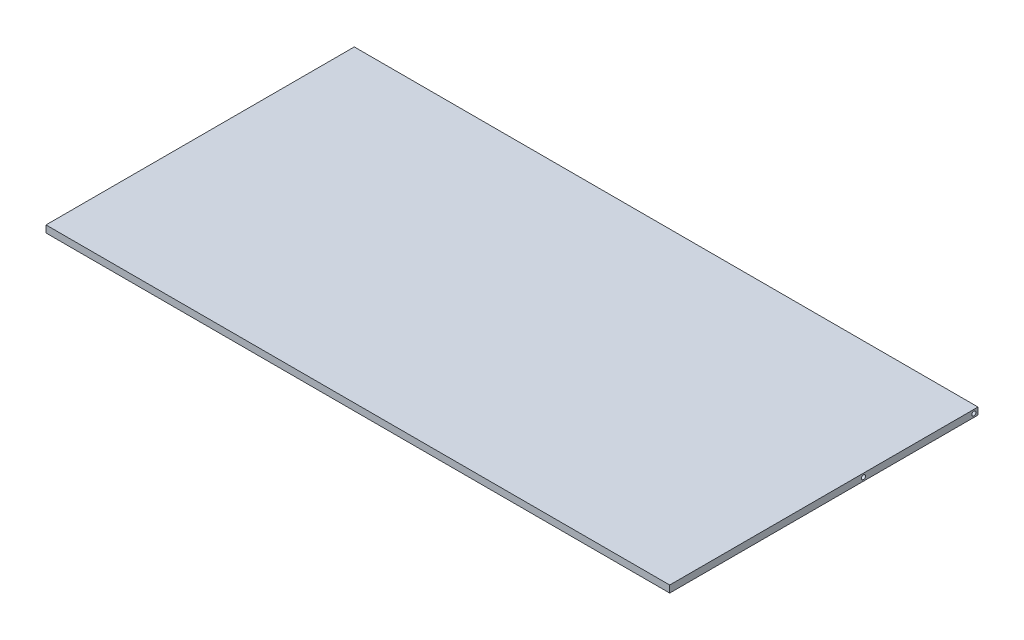
ISO-10303-21;
HEADER;
FILE_DESCRIPTION(('STEP AP214'),'2;1');
FILE_NAME('part.step','',(''),(''),'','','');
FILE_SCHEMA(('AUTOMOTIVE_DESIGN { 1 0 10303 214 1 1 1 1 }'));
ENDSEC;
DATA;
#1=APPLICATION_CONTEXT('core data for automotive mechanical design processes');
#2=APPLICATION_PROTOCOL_DEFINITION('international standard','automotive_design',2000,#1);
#3=PRODUCT_CONTEXT('',#1,'mechanical');
#4=PRODUCT('Part','Part','',(#3));
#5=PRODUCT_RELATED_PRODUCT_CATEGORY('part','',(#4));
#6=PRODUCT_DEFINITION_FORMATION('','',#4);
#7=PRODUCT_DEFINITION_CONTEXT('part definition',#1,'design');
#8=PRODUCT_DEFINITION('design','',#6,#7);
#9=PRODUCT_DEFINITION_SHAPE('','',#8);
#10=(LENGTH_UNIT() NAMED_UNIT(*) SI_UNIT(.MILLI.,.METRE.));
#11=(NAMED_UNIT(*) PLANE_ANGLE_UNIT() SI_UNIT($,.RADIAN.));
#12=(NAMED_UNIT(*) SI_UNIT($,.STERADIAN.) SOLID_ANGLE_UNIT());
#13=UNCERTAINTY_MEASURE_WITH_UNIT(LENGTH_MEASURE(1.E-05),#10,'distance_accuracy_value','');
#14=(GEOMETRIC_REPRESENTATION_CONTEXT(3) GLOBAL_UNCERTAINTY_ASSIGNED_CONTEXT((#13)) GLOBAL_UNIT_ASSIGNED_CONTEXT((#10,
#11,#12)) REPRESENTATION_CONTEXT('',''));
#15=CARTESIAN_POINT('',(0.,0.,0.));
#16=DIRECTION('',(0.,0.,1.));
#17=DIRECTION('',(1.,0.,0.));
#18=AXIS2_PLACEMENT_3D('',#15,#16,#17);
#19=CARTESIAN_POINT('',(0.,12.7,0.));
#20=DIRECTION('',(1.,0.,0.));
#21=DIRECTION('',(0.,0.,-1.));
#22=AXIS2_PLACEMENT_3D('',#19,#20,#21);
#23=PLANE('',#22);
#24=DIRECTION('',(0.,0.,1.));
#25=VECTOR('',#24,1.);
#26=CARTESIAN_POINT('',(0.,0.,0.));
#27=LINE('',#26,#25);
#28=CARTESIAN_POINT('',(0.,0.,-558.8));
#29=VERTEX_POINT('',#28);
#30=CARTESIAN_POINT('',(0.,0.,0.));
#31=VERTEX_POINT('',#30);
#32=EDGE_CURVE('E107',#29,#31,#27,.T.);
#33=ORIENTED_EDGE('',*,*,#32,.T.);
#34=DIRECTION('',(0.,-1.,0.));
#35=VECTOR('',#34,1.);
#36=CARTESIAN_POINT('',(0.,12.7,0.));
#37=LINE('',#36,#35);
#38=CARTESIAN_POINT('',(0.,12.7,0.));
#39=VERTEX_POINT('',#38);
#40=EDGE_CURVE('E11',#39,#31,#37,.T.);
#41=ORIENTED_EDGE('',*,*,#40,.F.);
#42=DIRECTION('',(0.,0.,1.));
#43=VECTOR('',#42,1.);
#44=CARTESIAN_POINT('',(0.,12.7,0.));
#45=LINE('',#44,#43);
#46=CARTESIAN_POINT('',(0.,12.7,-558.8));
#47=VERTEX_POINT('',#46);
#48=EDGE_CURVE('E91',#47,#39,#45,.T.);
#49=ORIENTED_EDGE('',*,*,#48,.F.);
#50=DIRECTION('',(0.,-1.,0.));
#51=VECTOR('',#50,1.);
#52=CARTESIAN_POINT('',(0.,12.7,-558.8));
#53=LINE('',#52,#51);
#54=EDGE_CURVE('E103',#47,#29,#53,.T.);
#55=ORIENTED_EDGE('',*,*,#54,.T.);
#56=EDGE_LOOP('',(#33,#41,#49,#55));
#57=FACE_BOUND('',#56,.T.);
#58=ADVANCED_FACE('F39',(#57),#23,.F.);
#59=CARTESIAN_POINT('',(0.,12.7,0.));
#60=DIRECTION('',(0.,0.,-1.));
#61=DIRECTION('',(-1.,0.,0.));
#62=AXIS2_PLACEMENT_3D('',#59,#60,#61);
#63=PLANE('',#62);
#64=DIRECTION('',(1.,0.,0.));
#65=VECTOR('',#64,1.);
#66=CARTESIAN_POINT('',(0.,0.,0.));
#67=LINE('',#66,#65);
#68=CARTESIAN_POINT('',(1130.47063339731,0.,0.));
#69=VERTEX_POINT('',#68);
#70=EDGE_CURVE('E96',#31,#69,#67,.T.);
#71=ORIENTED_EDGE('',*,*,#70,.T.);
#72=DIRECTION('',(0.,-1.,0.));
#73=VECTOR('',#72,1.);
#74=CARTESIAN_POINT('',(1130.47063339731,12.7,0.));
#75=LINE('',#74,#73);
#76=CARTESIAN_POINT('',(1130.47063339731,12.7,0.));
#77=VERTEX_POINT('',#76);
#78=EDGE_CURVE('E48',#77,#69,#75,.T.);
#79=ORIENTED_EDGE('',*,*,#78,.F.);
#80=DIRECTION('',(1.,0.,0.));
#81=VECTOR('',#80,1.);
#82=CARTESIAN_POINT('',(0.,12.7,0.));
#83=LINE('',#82,#81);
#84=EDGE_CURVE('E86',#39,#77,#83,.T.);
#85=ORIENTED_EDGE('',*,*,#84,.F.);
#86=ORIENTED_EDGE('',*,*,#40,.T.);
#87=EDGE_LOOP('',(#71,#79,#85,#86));
#88=FACE_BOUND('',#87,.T.);
#89=ADVANCED_FACE('F95',(#88),#63,.F.);
#90=CARTESIAN_POINT('',(1130.47063339731,12.7,0.));
#91=DIRECTION('',(-1.,0.,0.));
#92=DIRECTION('',(0.,0.,1.));
#93=AXIS2_PLACEMENT_3D('',#90,#91,#92);
#94=PLANE('',#93);
#95=CARTESIAN_POINT('',(1130.47063339731,6.35,-551.3));
#96=DIRECTION('',(1.,0.,0.));
#97=DIRECTION('',(0.,0.,-1.));
#98=AXIS2_PLACEMENT_3D('',#95,#96,#97);
#99=CIRCLE('',#98,3.74999999999998);
#100=CARTESIAN_POINT('',(1130.47063339731,6.35,-555.05));
#101=VERTEX_POINT('',#100);
#102=EDGE_CURVE('E136',#101,#101,#99,.T.);
#103=ORIENTED_EDGE('',*,*,#102,.F.);
#104=EDGE_LOOP('',(#103));
#105=FACE_BOUND('',#104,.T.);
#106=CARTESIAN_POINT('',(1130.47063339731,6.35,-351.3));
#107=DIRECTION('',(1.,0.,0.));
#108=DIRECTION('',(0.,0.,-1.));
#109=AXIS2_PLACEMENT_3D('',#106,#107,#108);
#110=CIRCLE('',#109,3.74999999999998);
#111=CARTESIAN_POINT('',(1130.47063339731,6.35,-355.05));
#112=VERTEX_POINT('',#111);
#113=EDGE_CURVE('E128',#112,#112,#110,.T.);
#114=ORIENTED_EDGE('',*,*,#113,.F.);
#115=EDGE_LOOP('',(#114));
#116=FACE_BOUND('',#115,.T.);
#117=DIRECTION('',(0.,0.,-1.));
#118=VECTOR('',#117,1.);
#119=CARTESIAN_POINT('',(1130.47063339731,0.,0.));
#120=LINE('',#119,#118);
#121=CARTESIAN_POINT('',(1130.47063339731,0.,-558.8));
#122=VERTEX_POINT('',#121);
#123=EDGE_CURVE('E73',#69,#122,#120,.T.);
#124=ORIENTED_EDGE('',*,*,#123,.T.);
#125=DIRECTION('',(0.,-1.,0.));
#126=VECTOR('',#125,1.);
#127=CARTESIAN_POINT('',(1130.47063339731,12.7,-558.8));
#128=LINE('',#127,#126);
#129=CARTESIAN_POINT('',(1130.47063339731,12.7,-558.8));
#130=VERTEX_POINT('',#129);
#131=EDGE_CURVE('E98',#130,#122,#128,.T.);
#132=ORIENTED_EDGE('',*,*,#131,.F.);
#133=DIRECTION('',(0.,0.,-1.));
#134=VECTOR('',#133,1.);
#135=CARTESIAN_POINT('',(1130.47063339731,12.7,0.));
#136=LINE('',#135,#134);
#137=EDGE_CURVE('E89',#77,#130,#136,.T.);
#138=ORIENTED_EDGE('',*,*,#137,.F.);
#139=ORIENTED_EDGE('',*,*,#78,.T.);
#140=EDGE_LOOP('',(#124,#132,#138,#139));
#141=FACE_BOUND('',#140,.T.);
#142=ADVANCED_FACE('F99',(#105,#116,#141),#94,.F.);
#143=CARTESIAN_POINT('',(0.,12.7,-558.8));
#144=DIRECTION('',(0.,0.,1.));
#145=DIRECTION('',(1.,0.,0.));
#146=AXIS2_PLACEMENT_3D('',#143,#144,#145);
#147=PLANE('',#146);
#148=DIRECTION('',(-1.,0.,0.));
#149=VECTOR('',#148,1.);
#150=CARTESIAN_POINT('',(0.,0.,-558.8));
#151=LINE('',#150,#149);
#152=EDGE_CURVE('E79',#122,#29,#151,.T.);
#153=ORIENTED_EDGE('',*,*,#152,.T.);
#154=ORIENTED_EDGE('',*,*,#54,.F.);
#155=DIRECTION('',(-1.,0.,0.));
#156=VECTOR('',#155,1.);
#157=CARTESIAN_POINT('',(0.,12.7,-558.8));
#158=LINE('',#157,#156);
#159=EDGE_CURVE('E56',#130,#47,#158,.T.);
#160=ORIENTED_EDGE('',*,*,#159,.F.);
#161=ORIENTED_EDGE('',*,*,#131,.T.);
#162=EDGE_LOOP('',(#153,#154,#160,#161));
#163=FACE_BOUND('',#162,.T.);
#164=ADVANCED_FACE('F121',(#163),#147,.F.);
#165=CARTESIAN_POINT('',(0.,12.7,0.));
#166=DIRECTION('',(0.,-1.,0.));
#167=DIRECTION('',(0.,0.,-1.));
#168=AXIS2_PLACEMENT_3D('',#165,#166,#167);
#169=PLANE('',#168);
#170=ORIENTED_EDGE('',*,*,#48,.T.);
#171=ORIENTED_EDGE('',*,*,#84,.T.);
#172=ORIENTED_EDGE('',*,*,#137,.T.);
#173=ORIENTED_EDGE('',*,*,#159,.T.);
#174=EDGE_LOOP('',(#170,#171,#172,#173));
#175=FACE_BOUND('',#174,.T.);
#176=ADVANCED_FACE('F87',(#175),#169,.F.);
#177=CARTESIAN_POINT('',(0.,0.,0.));
#178=DIRECTION('',(0.,-1.,0.));
#179=DIRECTION('',(0.,0.,-1.));
#180=AXIS2_PLACEMENT_3D('',#177,#178,#179);
#181=PLANE('',#180);
#182=ORIENTED_EDGE('',*,*,#32,.F.);
#183=ORIENTED_EDGE('',*,*,#152,.F.);
#184=ORIENTED_EDGE('',*,*,#123,.F.);
#185=ORIENTED_EDGE('',*,*,#70,.F.);
#186=EDGE_LOOP('',(#182,#183,#184,#185));
#187=FACE_BOUND('',#186,.T.);
#188=ADVANCED_FACE('F124',(#187),#181,.T.);
#189=CARTESIAN_POINT('',(1120.47063339731,6.35,-351.3));
#190=DIRECTION('',(1.,0.,0.));
#191=DIRECTION('',(0.,0.,-1.));
#192=AXIS2_PLACEMENT_3D('',#189,#190,#191);
#193=CYLINDRICAL_SURFACE('',#192,3.74999999999998);
#194=CARTESIAN_POINT('',(1120.47063339731,6.35,-351.3));
#195=DIRECTION('',(1.,0.,0.));
#196=DIRECTION('',(0.,0.,-1.));
#197=AXIS2_PLACEMENT_3D('',#194,#195,#196);
#198=CIRCLE('',#197,3.74999999999998);
#199=CARTESIAN_POINT('',(1120.47063339731,6.35,-355.05));
#200=VERTEX_POINT('',#199);
#201=EDGE_CURVE('E132',#200,#200,#198,.T.);
#202=ORIENTED_EDGE('',*,*,#201,.F.);
#203=EDGE_LOOP('',(#202));
#204=FACE_BOUND('',#203,.T.);
#205=ORIENTED_EDGE('',*,*,#113,.T.);
#206=EDGE_LOOP('',(#205));
#207=FACE_BOUND('',#206,.T.);
#208=ADVANCED_FACE('F158',(#204,#207),#193,.F.);
#209=CARTESIAN_POINT('',(1120.47063339731,6.35,-351.3));
#210=DIRECTION('',(1.,0.,0.));
#211=DIRECTION('',(0.,0.,-1.));
#212=AXIS2_PLACEMENT_3D('',#209,#210,#211);
#213=PLANE('',#212);
#214=ORIENTED_EDGE('',*,*,#201,.T.);
#215=EDGE_LOOP('',(#214));
#216=FACE_BOUND('',#215,.T.);
#217=ADVANCED_FACE('F149',(#216),#213,.T.);
#218=CARTESIAN_POINT('',(1120.47063339731,6.35,-551.3));
#219=DIRECTION('',(1.,0.,0.));
#220=DIRECTION('',(0.,0.,-1.));
#221=AXIS2_PLACEMENT_3D('',#218,#219,#220);
#222=CYLINDRICAL_SURFACE('',#221,3.74999999999998);
#223=CARTESIAN_POINT('',(1120.47063339731,6.35,-551.3));
#224=DIRECTION('',(1.,0.,0.));
#225=DIRECTION('',(0.,0.,-1.));
#226=AXIS2_PLACEMENT_3D('',#223,#224,#225);
#227=CIRCLE('',#226,3.74999999999998);
#228=CARTESIAN_POINT('',(1120.47063339731,6.35,-555.05));
#229=VERTEX_POINT('',#228);
#230=EDGE_CURVE('E111',#229,#229,#227,.T.);
#231=ORIENTED_EDGE('',*,*,#230,.F.);
#232=EDGE_LOOP('',(#231));
#233=FACE_BOUND('',#232,.T.);
#234=ORIENTED_EDGE('',*,*,#102,.T.);
#235=EDGE_LOOP('',(#234));
#236=FACE_BOUND('',#235,.T.);
#237=ADVANCED_FACE('F146',(#233,#236),#222,.F.);
#238=CARTESIAN_POINT('',(1120.47063339731,6.35,-551.3));
#239=DIRECTION('',(1.,0.,0.));
#240=DIRECTION('',(0.,0.,-1.));
#241=AXIS2_PLACEMENT_3D('',#238,#239,#240);
#242=PLANE('',#241);
#243=ORIENTED_EDGE('',*,*,#230,.T.);
#244=EDGE_LOOP('',(#243));
#245=FACE_BOUND('',#244,.T.);
#246=ADVANCED_FACE('F144',(#245),#242,.T.);
#247=CLOSED_SHELL('',(#58,#89,#142,#164,#176,#188,#208,#217,#237,#246));
#248=MANIFOLD_SOLID_BREP('B2',#247);
#249=ADVANCED_BREP_SHAPE_REPRESENTATION('',(#18,#248),#14);
#250=SHAPE_DEFINITION_REPRESENTATION(#9,#249);
ENDSEC;
END-ISO-10303-21;
